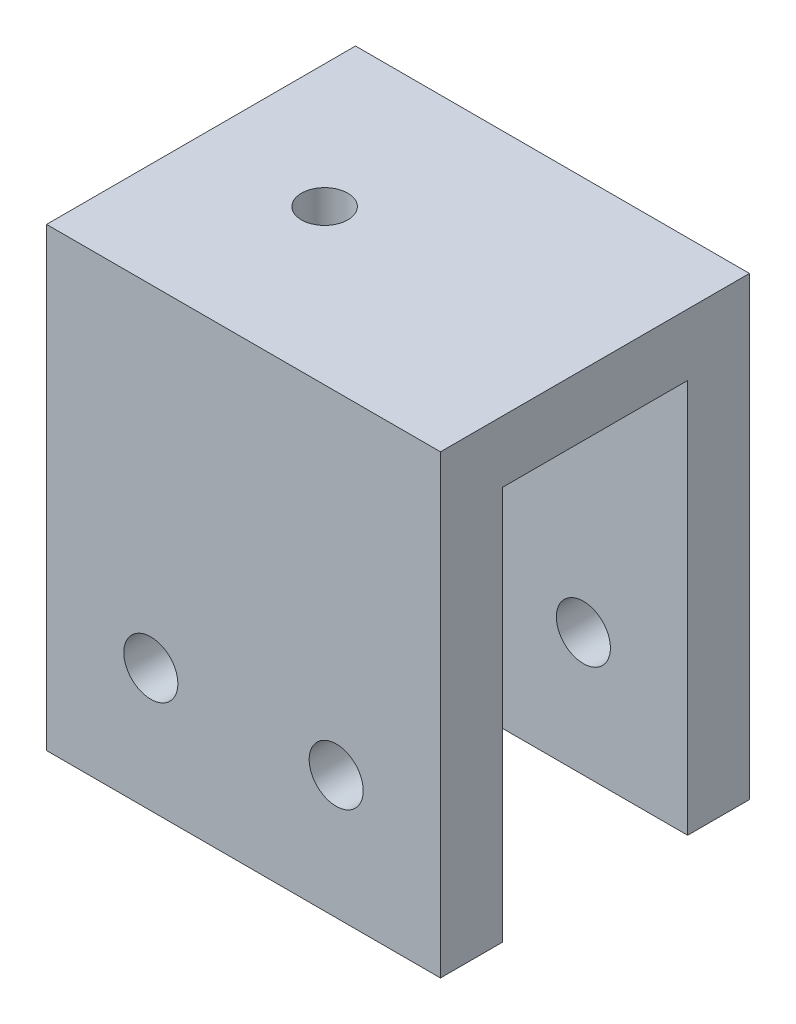
ISO-10303-21;
HEADER;
FILE_DESCRIPTION(('STEP AP214'),'2;1');
FILE_NAME('part.step','',(''),(''),'','','');
FILE_SCHEMA(('AUTOMOTIVE_DESIGN { 1 0 10303 214 1 1 1 1 }'));
ENDSEC;
DATA;
#1=APPLICATION_CONTEXT('core data for automotive mechanical design processes');
#2=APPLICATION_PROTOCOL_DEFINITION('international standard','automotive_design',2000,#1);
#3=PRODUCT_CONTEXT('',#1,'mechanical');
#4=PRODUCT('Part','Part','',(#3));
#5=PRODUCT_RELATED_PRODUCT_CATEGORY('part','',(#4));
#6=PRODUCT_DEFINITION_FORMATION('','',#4);
#7=PRODUCT_DEFINITION_CONTEXT('part definition',#1,'design');
#8=PRODUCT_DEFINITION('design','',#6,#7);
#9=PRODUCT_DEFINITION_SHAPE('','',#8);
#10=(LENGTH_UNIT() NAMED_UNIT(*) SI_UNIT(.MILLI.,.METRE.));
#11=(NAMED_UNIT(*) PLANE_ANGLE_UNIT() SI_UNIT($,.RADIAN.));
#12=(NAMED_UNIT(*) SI_UNIT($,.STERADIAN.) SOLID_ANGLE_UNIT());
#13=UNCERTAINTY_MEASURE_WITH_UNIT(LENGTH_MEASURE(1.E-05),#10,'distance_accuracy_value','');
#14=(GEOMETRIC_REPRESENTATION_CONTEXT(3) GLOBAL_UNCERTAINTY_ASSIGNED_CONTEXT((#13)) GLOBAL_UNIT_ASSIGNED_CONTEXT((#10,
#11,#12)) REPRESENTATION_CONTEXT('',''));
#15=CARTESIAN_POINT('',(0.,0.,0.));
#16=DIRECTION('',(0.,0.,1.));
#17=DIRECTION('',(1.,0.,0.));
#18=AXIS2_PLACEMENT_3D('',#15,#16,#17);
#19=CARTESIAN_POINT('',(0.,12.75,0.));
#20=DIRECTION('',(0.,1.,0.));
#21=DIRECTION('',(-1.,0.,0.));
#22=AXIS2_PLACEMENT_3D('',#19,#20,#21);
#23=PLANE('',#22);
#24=CARTESIAN_POINT('',(-8.75,12.75,-3.));
#25=DIRECTION('',(0.,1.,0.));
#26=DIRECTION('',(-1.,0.,0.));
#27=AXIS2_PLACEMENT_3D('',#24,#25,#26);
#28=CIRCLE('',#27,0.749999999999999);
#29=CARTESIAN_POINT('',(-9.5,12.75,-3.));
#30=VERTEX_POINT('',#29);
#31=EDGE_CURVE('E195',#30,#30,#28,.T.);
#32=ORIENTED_EDGE('',*,*,#31,.T.);
#33=EDGE_LOOP('',(#32));
#34=FACE_BOUND('',#33,.T.);
#35=DIRECTION('',(1.,0.,0.));
#36=VECTOR('',#35,1.);
#37=CARTESIAN_POINT('',(-12.75,12.75,-6.));
#38=LINE('',#37,#36);
#39=CARTESIAN_POINT('',(-12.75,12.75,-6.));
#40=VERTEX_POINT('',#39);
#41=CARTESIAN_POINT('',(0.,12.75,-6.));
#42=VERTEX_POINT('',#41);
#43=EDGE_CURVE('E87',#40,#42,#38,.T.);
#44=ORIENTED_EDGE('',*,*,#43,.T.);
#45=DIRECTION('',(0.,0.,-1.));
#46=VECTOR('',#45,1.);
#47=CARTESIAN_POINT('',(0.,12.75,2.));
#48=LINE('',#47,#46);
#49=CARTESIAN_POINT('',(0.,12.75,0.));
#50=VERTEX_POINT('',#49);
#51=EDGE_CURVE('E69',#50,#42,#48,.T.);
#52=ORIENTED_EDGE('',*,*,#51,.F.);
#53=DIRECTION('',(-1.,0.,0.));
#54=VECTOR('',#53,1.);
#55=CARTESIAN_POINT('',(0.,12.75,0.));
#56=LINE('',#55,#54);
#57=CARTESIAN_POINT('',(-12.75,12.75,0.));
#58=VERTEX_POINT('',#57);
#59=EDGE_CURVE('E77',#50,#58,#56,.T.);
#60=ORIENTED_EDGE('',*,*,#59,.T.);
#61=DIRECTION('',(0.,0.,1.));
#62=VECTOR('',#61,1.);
#63=CARTESIAN_POINT('',(-12.75,12.75,2.));
#64=LINE('',#63,#62);
#65=EDGE_CURVE('E88',#40,#58,#64,.T.);
#66=ORIENTED_EDGE('',*,*,#65,.F.);
#67=EDGE_LOOP('',(#44,#52,#60,#66));
#68=FACE_BOUND('',#67,.T.);
#69=ADVANCED_FACE('F33',(#34,#68),#23,.F.);
#70=CARTESIAN_POINT('',(-12.75,0.,2.));
#71=DIRECTION('',(-1.,0.,0.));
#72=DIRECTION('',(0.,0.,1.));
#73=AXIS2_PLACEMENT_3D('',#70,#71,#72);
#74=PLANE('',#73);
#75=DIRECTION('',(0.,1.,0.));
#76=VECTOR('',#75,1.);
#77=CARTESIAN_POINT('',(-12.75,0.,0.));
#78=LINE('',#77,#76);
#79=CARTESIAN_POINT('',(-12.75,0.,0.));
#80=VERTEX_POINT('',#79);
#81=EDGE_CURVE('E80',#80,#58,#78,.T.);
#82=ORIENTED_EDGE('',*,*,#81,.F.);
#83=DIRECTION('',(0.,0.,-1.));
#84=VECTOR('',#83,1.);
#85=CARTESIAN_POINT('',(-12.75,0.,2.));
#86=LINE('',#85,#84);
#87=CARTESIAN_POINT('',(-12.75,0.,2.));
#88=VERTEX_POINT('',#87);
#89=EDGE_CURVE('E11',#88,#80,#86,.T.);
#90=ORIENTED_EDGE('',*,*,#89,.F.);
#91=DIRECTION('',(0.,1.,0.));
#92=VECTOR('',#91,1.);
#93=CARTESIAN_POINT('',(-12.75,0.,2.));
#94=LINE('',#93,#92);
#95=CARTESIAN_POINT('',(-12.75,14.75,2.));
#96=VERTEX_POINT('',#95);
#97=EDGE_CURVE('E72',#88,#96,#94,.T.);
#98=ORIENTED_EDGE('',*,*,#97,.T.);
#99=DIRECTION('',(0.,0.,1.));
#100=VECTOR('',#99,1.);
#101=CARTESIAN_POINT('',(-12.75,14.75,2.));
#102=LINE('',#101,#100);
#103=CARTESIAN_POINT('',(-12.75,14.75,-8.));
#104=VERTEX_POINT('',#103);
#105=EDGE_CURVE('E158',#104,#96,#102,.T.);
#106=ORIENTED_EDGE('',*,*,#105,.F.);
#107=DIRECTION('',(0.,-1.,0.));
#108=VECTOR('',#107,1.);
#109=CARTESIAN_POINT('',(-12.75,14.75,-8.));
#110=LINE('',#109,#108);
#111=CARTESIAN_POINT('',(-12.75,0.,-8.));
#112=VERTEX_POINT('',#111);
#113=EDGE_CURVE('E101',#104,#112,#110,.T.);
#114=ORIENTED_EDGE('',*,*,#113,.T.);
#115=DIRECTION('',(0.,0.,1.));
#116=VECTOR('',#115,1.);
#117=CARTESIAN_POINT('',(-12.75,0.,-8.));
#118=LINE('',#117,#116);
#119=CARTESIAN_POINT('',(-12.75,0.,-6.));
#120=VERTEX_POINT('',#119);
#121=EDGE_CURVE('E95',#112,#120,#118,.T.);
#122=ORIENTED_EDGE('',*,*,#121,.T.);
#123=DIRECTION('',(0.,1.,0.));
#124=VECTOR('',#123,1.);
#125=CARTESIAN_POINT('',(-12.75,0.,-6.));
#126=LINE('',#125,#124);
#127=EDGE_CURVE('E123',#120,#40,#126,.T.);
#128=ORIENTED_EDGE('',*,*,#127,.T.);
#129=ORIENTED_EDGE('',*,*,#65,.T.);
#130=EDGE_LOOP('',(#82,#90,#98,#106,#114,#122,#128,#129));
#131=FACE_BOUND('',#130,.T.);
#132=ADVANCED_FACE('F35',(#131),#74,.T.);
#133=CARTESIAN_POINT('',(0.,0.,2.));
#134=DIRECTION('',(0.,-1.,0.));
#135=DIRECTION('',(1.,0.,0.));
#136=AXIS2_PLACEMENT_3D('',#133,#134,#135);
#137=PLANE('',#136);
#138=DIRECTION('',(-1.,0.,0.));
#139=VECTOR('',#138,1.);
#140=CARTESIAN_POINT('',(0.,0.,0.));
#141=LINE('',#140,#139);
#142=CARTESIAN_POINT('',(0.,0.,0.));
#143=VERTEX_POINT('',#142);
#144=EDGE_CURVE('E73',#143,#80,#141,.T.);
#145=ORIENTED_EDGE('',*,*,#144,.F.);
#146=DIRECTION('',(0.,0.,-1.));
#147=VECTOR('',#146,1.);
#148=CARTESIAN_POINT('',(0.,0.,2.));
#149=LINE('',#148,#147);
#150=CARTESIAN_POINT('',(0.,0.,2.));
#151=VERTEX_POINT('',#150);
#152=EDGE_CURVE('E43',#151,#143,#149,.T.);
#153=ORIENTED_EDGE('',*,*,#152,.F.);
#154=DIRECTION('',(-1.,0.,0.));
#155=VECTOR('',#154,1.);
#156=CARTESIAN_POINT('',(0.,0.,2.));
#157=LINE('',#156,#155);
#158=EDGE_CURVE('E108',#151,#88,#157,.T.);
#159=ORIENTED_EDGE('',*,*,#158,.T.);
#160=ORIENTED_EDGE('',*,*,#89,.T.);
#161=EDGE_LOOP('',(#145,#153,#159,#160));
#162=FACE_BOUND('',#161,.T.);
#163=ADVANCED_FACE('F115',(#162),#137,.T.);
#164=CARTESIAN_POINT('',(0.,0.,2.));
#165=DIRECTION('',(-1.,0.,0.));
#166=DIRECTION('',(0.,-1.,0.));
#167=AXIS2_PLACEMENT_3D('',#164,#165,#166);
#168=PLANE('',#167);
#169=DIRECTION('',(0.,1.,0.));
#170=VECTOR('',#169,1.);
#171=CARTESIAN_POINT('',(0.,0.,0.));
#172=LINE('',#171,#170);
#173=EDGE_CURVE('E63',#143,#50,#172,.T.);
#174=ORIENTED_EDGE('',*,*,#173,.T.);
#175=ORIENTED_EDGE('',*,*,#51,.T.);
#176=DIRECTION('',(0.,-1.,0.));
#177=VECTOR('',#176,1.);
#178=CARTESIAN_POINT('',(0.,12.75,-6.));
#179=LINE('',#178,#177);
#180=CARTESIAN_POINT('',(0.,0.,-6.));
#181=VERTEX_POINT('',#180);
#182=EDGE_CURVE('E168',#42,#181,#179,.T.);
#183=ORIENTED_EDGE('',*,*,#182,.T.);
#184=DIRECTION('',(0.,0.,1.));
#185=VECTOR('',#184,1.);
#186=CARTESIAN_POINT('',(0.,0.,-8.));
#187=LINE('',#186,#185);
#188=CARTESIAN_POINT('',(0.,0.,-8.));
#189=VERTEX_POINT('',#188);
#190=EDGE_CURVE('E89',#189,#181,#187,.T.);
#191=ORIENTED_EDGE('',*,*,#190,.F.);
#192=DIRECTION('',(0.,-1.,0.));
#193=VECTOR('',#192,1.);
#194=CARTESIAN_POINT('',(0.,14.75,-8.));
#195=LINE('',#194,#193);
#196=CARTESIAN_POINT('',(0.,14.75,-8.));
#197=VERTEX_POINT('',#196);
#198=EDGE_CURVE('E83',#197,#189,#195,.T.);
#199=ORIENTED_EDGE('',*,*,#198,.F.);
#200=DIRECTION('',(0.,0.,-1.));
#201=VECTOR('',#200,1.);
#202=CARTESIAN_POINT('',(0.,14.75,2.));
#203=LINE('',#202,#201);
#204=CARTESIAN_POINT('',(0.,14.75,2.));
#205=VERTEX_POINT('',#204);
#206=EDGE_CURVE('E92',#205,#197,#203,.T.);
#207=ORIENTED_EDGE('',*,*,#206,.F.);
#208=DIRECTION('',(0.,1.,0.));
#209=VECTOR('',#208,1.);
#210=CARTESIAN_POINT('',(0.,0.,2.));
#211=LINE('',#210,#209);
#212=EDGE_CURVE('E110',#151,#205,#211,.T.);
#213=ORIENTED_EDGE('',*,*,#212,.F.);
#214=ORIENTED_EDGE('',*,*,#152,.T.);
#215=EDGE_LOOP('',(#174,#175,#183,#191,#199,#207,#213,#214));
#216=FACE_BOUND('',#215,.T.);
#217=ADVANCED_FACE('F65',(#216),#168,.F.);
#218=CARTESIAN_POINT('',(0.,0.,2.));
#219=DIRECTION('',(0.,0.,-1.));
#220=DIRECTION('',(-1.,0.,0.));
#221=AXIS2_PLACEMENT_3D('',#218,#219,#220);
#222=PLANE('',#221);
#223=CARTESIAN_POINT('',(-9.375,4.,2.));
#224=DIRECTION('',(0.,0.,1.));
#225=DIRECTION('',(1.,0.,0.));
#226=AXIS2_PLACEMENT_3D('',#223,#224,#225);
#227=CIRCLE('',#226,0.874999999999987);
#228=CARTESIAN_POINT('',(-8.50000000000001,4.,2.));
#229=VERTEX_POINT('',#228);
#230=EDGE_CURVE('E192',#229,#229,#227,.T.);
#231=ORIENTED_EDGE('',*,*,#230,.F.);
#232=EDGE_LOOP('',(#231));
#233=FACE_BOUND('',#232,.T.);
#234=CARTESIAN_POINT('',(-3.375,4.,2.));
#235=DIRECTION('',(0.,0.,1.));
#236=DIRECTION('',(1.,0.,0.));
#237=AXIS2_PLACEMENT_3D('',#234,#235,#236);
#238=CIRCLE('',#237,0.874999999999987);
#239=CARTESIAN_POINT('',(-2.50000000000001,4.,2.));
#240=VERTEX_POINT('',#239);
#241=EDGE_CURVE('E183',#240,#240,#238,.T.);
#242=ORIENTED_EDGE('',*,*,#241,.F.);
#243=EDGE_LOOP('',(#242));
#244=FACE_BOUND('',#243,.T.);
#245=ORIENTED_EDGE('',*,*,#212,.T.);
#246=DIRECTION('',(1.,0.,0.));
#247=VECTOR('',#246,1.);
#248=CARTESIAN_POINT('',(0.,14.75,2.));
#249=LINE('',#248,#247);
#250=EDGE_CURVE('E98',#96,#205,#249,.T.);
#251=ORIENTED_EDGE('',*,*,#250,.F.);
#252=ORIENTED_EDGE('',*,*,#97,.F.);
#253=ORIENTED_EDGE('',*,*,#158,.F.);
#254=EDGE_LOOP('',(#245,#251,#252,#253));
#255=FACE_BOUND('',#254,.T.);
#256=ADVANCED_FACE('F150',(#233,#244,#255),#222,.F.);
#257=CARTESIAN_POINT('',(0.,0.,0.));
#258=DIRECTION('',(0.,0.,-1.));
#259=DIRECTION('',(-1.,0.,0.));
#260=AXIS2_PLACEMENT_3D('',#257,#258,#259);
#261=PLANE('',#260);
#262=CARTESIAN_POINT('',(-9.375,4.,0.));
#263=DIRECTION('',(0.,0.,-1.));
#264=DIRECTION('',(-1.,0.,0.));
#265=AXIS2_PLACEMENT_3D('',#262,#263,#264);
#266=CIRCLE('',#265,0.874999999999993);
#267=CARTESIAN_POINT('',(-10.25,4.,0.));
#268=VERTEX_POINT('',#267);
#269=EDGE_CURVE('E186',#268,#268,#266,.T.);
#270=ORIENTED_EDGE('',*,*,#269,.F.);
#271=EDGE_LOOP('',(#270));
#272=FACE_BOUND('',#271,.T.);
#273=CARTESIAN_POINT('',(-3.375,4.,0.));
#274=DIRECTION('',(0.,0.,-1.));
#275=DIRECTION('',(-1.,0.,0.));
#276=AXIS2_PLACEMENT_3D('',#273,#274,#275);
#277=CIRCLE('',#276,0.874999999999993);
#278=CARTESIAN_POINT('',(-4.24999999999999,4.,0.));
#279=VERTEX_POINT('',#278);
#280=EDGE_CURVE('E177',#279,#279,#277,.T.);
#281=ORIENTED_EDGE('',*,*,#280,.F.);
#282=EDGE_LOOP('',(#281));
#283=FACE_BOUND('',#282,.T.);
#284=ORIENTED_EDGE('',*,*,#59,.F.);
#285=ORIENTED_EDGE('',*,*,#173,.F.);
#286=ORIENTED_EDGE('',*,*,#144,.T.);
#287=ORIENTED_EDGE('',*,*,#81,.T.);
#288=EDGE_LOOP('',(#284,#285,#286,#287));
#289=FACE_BOUND('',#288,.T.);
#290=ADVANCED_FACE('F78',(#272,#283,#289),#261,.T.);
#291=CARTESIAN_POINT('',(0.,14.75,-8.));
#292=DIRECTION('',(0.,0.,1.));
#293=DIRECTION('',(1.,0.,0.));
#294=AXIS2_PLACEMENT_3D('',#291,#292,#293);
#295=PLANE('',#294);
#296=CARTESIAN_POINT('',(-9.375,4.,-8.));
#297=DIRECTION('',(0.,0.,1.));
#298=DIRECTION('',(1.,0.,0.));
#299=AXIS2_PLACEMENT_3D('',#296,#297,#298);
#300=CIRCLE('',#299,0.874999999999999);
#301=CARTESIAN_POINT('',(-8.5,4.,-8.));
#302=VERTEX_POINT('',#301);
#303=EDGE_CURVE('E189',#302,#302,#300,.T.);
#304=ORIENTED_EDGE('',*,*,#303,.T.);
#305=EDGE_LOOP('',(#304));
#306=FACE_BOUND('',#305,.T.);
#307=CARTESIAN_POINT('',(-3.375,4.,-8.));
#308=DIRECTION('',(0.,0.,1.));
#309=DIRECTION('',(1.,0.,0.));
#310=AXIS2_PLACEMENT_3D('',#307,#308,#309);
#311=CIRCLE('',#310,0.874999999999998);
#312=CARTESIAN_POINT('',(-2.5,4.,-8.));
#313=VERTEX_POINT('',#312);
#314=EDGE_CURVE('E180',#313,#313,#311,.T.);
#315=ORIENTED_EDGE('',*,*,#314,.T.);
#316=EDGE_LOOP('',(#315));
#317=FACE_BOUND('',#316,.T.);
#318=ORIENTED_EDGE('',*,*,#198,.T.);
#319=DIRECTION('',(-1.,0.,0.));
#320=VECTOR('',#319,1.);
#321=CARTESIAN_POINT('',(0.,0.,-8.));
#322=LINE('',#321,#320);
#323=EDGE_CURVE('E165',#189,#112,#322,.T.);
#324=ORIENTED_EDGE('',*,*,#323,.T.);
#325=ORIENTED_EDGE('',*,*,#113,.F.);
#326=DIRECTION('',(-1.,0.,0.));
#327=VECTOR('',#326,1.);
#328=CARTESIAN_POINT('',(0.,14.75,-8.));
#329=LINE('',#328,#327);
#330=EDGE_CURVE('E160',#197,#104,#329,.T.);
#331=ORIENTED_EDGE('',*,*,#330,.F.);
#332=EDGE_LOOP('',(#318,#324,#325,#331));
#333=FACE_BOUND('',#332,.T.);
#334=ADVANCED_FACE('F207',(#306,#317,#333),#295,.F.);
#335=CARTESIAN_POINT('',(0.,14.75,0.));
#336=DIRECTION('',(0.,1.,0.));
#337=DIRECTION('',(-1.,0.,0.));
#338=AXIS2_PLACEMENT_3D('',#335,#336,#337);
#339=PLANE('',#338);
#340=CARTESIAN_POINT('',(-8.75,14.75,-3.));
#341=DIRECTION('',(0.,1.,0.));
#342=DIRECTION('',(0.,0.,1.));
#343=AXIS2_PLACEMENT_3D('',#340,#341,#342);
#344=CIRCLE('',#343,0.750000000000001);
#345=CARTESIAN_POINT('',(-8.75,14.75,-2.25));
#346=VERTEX_POINT('',#345);
#347=EDGE_CURVE('E198',#346,#346,#344,.T.);
#348=ORIENTED_EDGE('',*,*,#347,.F.);
#349=EDGE_LOOP('',(#348));
#350=FACE_BOUND('',#349,.T.);
#351=ORIENTED_EDGE('',*,*,#206,.T.);
#352=ORIENTED_EDGE('',*,*,#330,.T.);
#353=ORIENTED_EDGE('',*,*,#105,.T.);
#354=ORIENTED_EDGE('',*,*,#250,.T.);
#355=EDGE_LOOP('',(#351,#352,#353,#354));
#356=FACE_BOUND('',#355,.T.);
#357=ADVANCED_FACE('F155',(#350,#356),#339,.T.);
#358=CARTESIAN_POINT('',(0.,0.,-8.));
#359=DIRECTION('',(0.,1.,0.));
#360=DIRECTION('',(-1.,0.,0.));
#361=AXIS2_PLACEMENT_3D('',#358,#359,#360);
#362=PLANE('',#361);
#363=DIRECTION('',(-1.,0.,0.));
#364=VECTOR('',#363,1.);
#365=CARTESIAN_POINT('',(0.,0.,-6.));
#366=LINE('',#365,#364);
#367=EDGE_CURVE('E166',#181,#120,#366,.T.);
#368=ORIENTED_EDGE('',*,*,#367,.T.);
#369=ORIENTED_EDGE('',*,*,#121,.F.);
#370=ORIENTED_EDGE('',*,*,#323,.F.);
#371=ORIENTED_EDGE('',*,*,#190,.T.);
#372=EDGE_LOOP('',(#368,#369,#370,#371));
#373=FACE_BOUND('',#372,.T.);
#374=ADVANCED_FACE('F206',(#373),#362,.F.);
#375=CARTESIAN_POINT('',(0.,0.,-6.));
#376=DIRECTION('',(0.,0.,-1.));
#377=DIRECTION('',(-1.,0.,0.));
#378=AXIS2_PLACEMENT_3D('',#375,#376,#377);
#379=PLANE('',#378);
#380=CARTESIAN_POINT('',(-9.375,4.,-6.));
#381=DIRECTION('',(0.,0.,-1.));
#382=DIRECTION('',(-1.,0.,0.));
#383=AXIS2_PLACEMENT_3D('',#380,#381,#382);
#384=CIRCLE('',#383,0.874999999999993);
#385=CARTESIAN_POINT('',(-10.25,4.,-6.));
#386=VERTEX_POINT('',#385);
#387=EDGE_CURVE('E37',#386,#386,#384,.T.);
#388=ORIENTED_EDGE('',*,*,#387,.T.);
#389=EDGE_LOOP('',(#388));
#390=FACE_BOUND('',#389,.T.);
#391=CARTESIAN_POINT('',(-3.375,4.,-6.));
#392=DIRECTION('',(0.,0.,-1.));
#393=DIRECTION('',(-1.,0.,0.));
#394=AXIS2_PLACEMENT_3D('',#391,#392,#393);
#395=CIRCLE('',#394,0.874999999999993);
#396=CARTESIAN_POINT('',(-4.24999999999999,4.,-6.));
#397=VERTEX_POINT('',#396);
#398=EDGE_CURVE('E172',#397,#397,#395,.T.);
#399=ORIENTED_EDGE('',*,*,#398,.T.);
#400=EDGE_LOOP('',(#399));
#401=FACE_BOUND('',#400,.T.);
#402=ORIENTED_EDGE('',*,*,#127,.F.);
#403=ORIENTED_EDGE('',*,*,#367,.F.);
#404=ORIENTED_EDGE('',*,*,#182,.F.);
#405=ORIENTED_EDGE('',*,*,#43,.F.);
#406=EDGE_LOOP('',(#402,#403,#404,#405));
#407=FACE_BOUND('',#406,.T.);
#408=ADVANCED_FACE('F213',(#390,#401,#407),#379,.F.);
#409=CARTESIAN_POINT('',(-3.375,4.,2.));
#410=DIRECTION('',(0.,0.,1.));
#411=DIRECTION('',(1.,0.,0.));
#412=AXIS2_PLACEMENT_3D('',#409,#410,#411);
#413=CYLINDRICAL_SURFACE('',#412,0.874999999999993);
#414=ORIENTED_EDGE('',*,*,#314,.F.);
#415=EDGE_LOOP('',(#414));
#416=FACE_BOUND('',#415,.T.);
#417=ORIENTED_EDGE('',*,*,#398,.F.);
#418=EDGE_LOOP('',(#417));
#419=FACE_BOUND('',#418,.T.);
#420=ADVANCED_FACE('F265',(#416,#419),#413,.F.);
#421=ORIENTED_EDGE('',*,*,#280,.T.);
#422=EDGE_LOOP('',(#421));
#423=FACE_BOUND('',#422,.T.);
#424=ORIENTED_EDGE('',*,*,#241,.T.);
#425=EDGE_LOOP('',(#424));
#426=FACE_BOUND('',#425,.T.);
#427=ADVANCED_FACE('F276',(#423,#426),#413,.F.);
#428=CARTESIAN_POINT('',(-9.375,4.,2.));
#429=DIRECTION('',(0.,0.,1.));
#430=DIRECTION('',(1.,0.,0.));
#431=AXIS2_PLACEMENT_3D('',#428,#429,#430);
#432=CYLINDRICAL_SURFACE('',#431,0.874999999999993);
#433=ORIENTED_EDGE('',*,*,#303,.F.);
#434=EDGE_LOOP('',(#433));
#435=FACE_BOUND('',#434,.T.);
#436=ORIENTED_EDGE('',*,*,#387,.F.);
#437=EDGE_LOOP('',(#436));
#438=FACE_BOUND('',#437,.T.);
#439=ADVANCED_FACE('F286',(#435,#438),#432,.F.);
#440=ORIENTED_EDGE('',*,*,#269,.T.);
#441=EDGE_LOOP('',(#440));
#442=FACE_BOUND('',#441,.T.);
#443=ORIENTED_EDGE('',*,*,#230,.T.);
#444=EDGE_LOOP('',(#443));
#445=FACE_BOUND('',#444,.T.);
#446=ADVANCED_FACE('F295',(#442,#445),#432,.F.);
#447=CARTESIAN_POINT('',(-8.75,14.75,-3.));
#448=DIRECTION('',(0.,1.,0.));
#449=DIRECTION('',(0.,0.,1.));
#450=AXIS2_PLACEMENT_3D('',#447,#448,#449);
#451=CYLINDRICAL_SURFACE('',#450,0.749999999999999);
#452=ORIENTED_EDGE('',*,*,#347,.T.);
#453=EDGE_LOOP('',(#452));
#454=FACE_BOUND('',#453,.T.);
#455=ORIENTED_EDGE('',*,*,#31,.F.);
#456=EDGE_LOOP('',(#455));
#457=FACE_BOUND('',#456,.T.);
#458=ADVANCED_FACE('F202',(#454,#457),#451,.F.);
#459=CLOSED_SHELL('',(#69,#132,#163,#217,#256,#290,#334,#357,#374,#408,#420,#427,#439,#446,#458));
#460=MANIFOLD_SOLID_BREP('B2',#459);
#461=ADVANCED_BREP_SHAPE_REPRESENTATION('',(#18,#460),#14);
#462=SHAPE_DEFINITION_REPRESENTATION(#9,#461);
ENDSEC;
END-ISO-10303-21;
